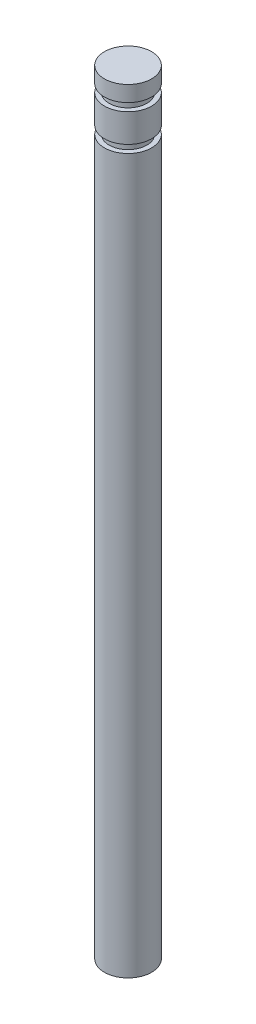
ISO-10303-21;
HEADER;
FILE_DESCRIPTION(('STEP AP214'),'2;1');
FILE_NAME('part.step','',(''),(''),'','','');
FILE_SCHEMA(('AUTOMOTIVE_DESIGN { 1 0 10303 214 1 1 1 1 }'));
ENDSEC;
DATA;
#1=APPLICATION_CONTEXT('core data for automotive mechanical design processes');
#2=APPLICATION_PROTOCOL_DEFINITION('international standard','automotive_design',2000,#1);
#3=PRODUCT_CONTEXT('',#1,'mechanical');
#4=PRODUCT('Part','Part','',(#3));
#5=PRODUCT_RELATED_PRODUCT_CATEGORY('part','',(#4));
#6=PRODUCT_DEFINITION_FORMATION('','',#4);
#7=PRODUCT_DEFINITION_CONTEXT('part definition',#1,'design');
#8=PRODUCT_DEFINITION('design','',#6,#7);
#9=PRODUCT_DEFINITION_SHAPE('','',#8);
#10=(LENGTH_UNIT() NAMED_UNIT(*) SI_UNIT(.MILLI.,.METRE.));
#11=(NAMED_UNIT(*) PLANE_ANGLE_UNIT() SI_UNIT($,.RADIAN.));
#12=(NAMED_UNIT(*) SI_UNIT($,.STERADIAN.) SOLID_ANGLE_UNIT());
#13=UNCERTAINTY_MEASURE_WITH_UNIT(LENGTH_MEASURE(1.E-05),#10,'distance_accuracy_value','');
#14=(GEOMETRIC_REPRESENTATION_CONTEXT(3) GLOBAL_UNCERTAINTY_ASSIGNED_CONTEXT((#13)) GLOBAL_UNIT_ASSIGNED_CONTEXT((#10,
#11,#12)) REPRESENTATION_CONTEXT('',''));
#15=CARTESIAN_POINT('',(0.,0.,0.));
#16=DIRECTION('',(0.,0.,1.));
#17=DIRECTION('',(1.,0.,0.));
#18=AXIS2_PLACEMENT_3D('',#15,#16,#17);
#19=CARTESIAN_POINT('',(0.,0.,0.));
#20=DIRECTION('',(0.,-1.,0.));
#21=DIRECTION('',(0.,0.,-1.));
#22=AXIS2_PLACEMENT_3D('',#19,#20,#21);
#23=CYLINDRICAL_SURFACE('',#22,1.2);
#24=CARTESIAN_POINT('',(0.,45.4,0.));
#25=DIRECTION('',(0.,-1.,0.));
#26=DIRECTION('',(0.,0.,-1.));
#27=AXIS2_PLACEMENT_3D('',#24,#25,#26);
#28=CIRCLE('',#27,1.2);
#29=CARTESIAN_POINT('',(0.,45.4,-1.2));
#30=VERTEX_POINT('',#29);
#31=EDGE_CURVE('E77',#30,#30,#28,.T.);
#32=ORIENTED_EDGE('',*,*,#31,.F.);
#33=EDGE_LOOP('',(#32));
#34=FACE_BOUND('',#33,.T.);
#35=CARTESIAN_POINT('',(0.,45.9,0.));
#36=DIRECTION('',(0.,-1.,0.));
#37=DIRECTION('',(0.,0.,-1.));
#38=AXIS2_PLACEMENT_3D('',#35,#36,#37);
#39=CIRCLE('',#38,1.2);
#40=CARTESIAN_POINT('',(0.,45.9,-1.2));
#41=VERTEX_POINT('',#40);
#42=EDGE_CURVE('E10',#41,#41,#39,.T.);
#43=ORIENTED_EDGE('',*,*,#42,.T.);
#44=EDGE_LOOP('',(#43));
#45=FACE_BOUND('',#44,.T.);
#46=ADVANCED_FACE('F43',(#34,#45),#23,.T.);
#47=CARTESIAN_POINT('',(0.,45.9,0.));
#48=DIRECTION('',(0.,1.,0.));
#49=DIRECTION('',(0.,0.,1.));
#50=AXIS2_PLACEMENT_3D('',#47,#48,#49);
#51=PLANE('',#50);
#52=ORIENTED_EDGE('',*,*,#42,.F.);
#53=EDGE_LOOP('',(#52));
#54=FACE_BOUND('',#53,.T.);
#55=CARTESIAN_POINT('',(0.,45.9,0.));
#56=DIRECTION('',(0.,-1.,0.));
#57=DIRECTION('',(0.,0.,-1.));
#58=AXIS2_PLACEMENT_3D('',#55,#56,#57);
#59=CIRCLE('',#58,1.5);
#60=CARTESIAN_POINT('',(0.,45.9,-1.5));
#61=VERTEX_POINT('',#60);
#62=EDGE_CURVE('E49',#61,#61,#59,.T.);
#63=ORIENTED_EDGE('',*,*,#62,.T.);
#64=EDGE_LOOP('',(#63));
#65=FACE_BOUND('',#64,.T.);
#66=ADVANCED_FACE('F85',(#54,#65),#51,.F.);
#67=CARTESIAN_POINT('',(0.,0.,0.));
#68=DIRECTION('',(0.,-1.,0.));
#69=DIRECTION('',(0.,0.,-1.));
#70=AXIS2_PLACEMENT_3D('',#67,#68,#69);
#71=CYLINDRICAL_SURFACE('',#70,1.5);
#72=CARTESIAN_POINT('',(0.,47.7,0.));
#73=DIRECTION('',(0.,-1.,0.));
#74=DIRECTION('',(0.,0.,-1.));
#75=AXIS2_PLACEMENT_3D('',#72,#73,#74);
#76=CIRCLE('',#75,1.5);
#77=CARTESIAN_POINT('',(0.,47.7,-1.5));
#78=VERTEX_POINT('',#77);
#79=EDGE_CURVE('E53',#78,#78,#76,.T.);
#80=ORIENTED_EDGE('',*,*,#79,.T.);
#81=EDGE_LOOP('',(#80));
#82=FACE_BOUND('',#81,.T.);
#83=ORIENTED_EDGE('',*,*,#62,.F.);
#84=EDGE_LOOP('',(#83));
#85=FACE_BOUND('',#84,.T.);
#86=ADVANCED_FACE('F89',(#82,#85),#71,.T.);
#87=CARTESIAN_POINT('',(0.,47.7,0.));
#88=DIRECTION('',(0.,1.,0.));
#89=DIRECTION('',(0.,0.,1.));
#90=AXIS2_PLACEMENT_3D('',#87,#88,#89);
#91=PLANE('',#90);
#92=CARTESIAN_POINT('',(0.,47.7,0.));
#93=DIRECTION('',(0.,-1.,0.));
#94=DIRECTION('',(0.,0.,-1.));
#95=AXIS2_PLACEMENT_3D('',#92,#93,#94);
#96=CIRCLE('',#95,1.2);
#97=CARTESIAN_POINT('',(0.,47.7,-1.2));
#98=VERTEX_POINT('',#97);
#99=EDGE_CURVE('E57',#98,#98,#96,.T.);
#100=ORIENTED_EDGE('',*,*,#99,.T.);
#101=EDGE_LOOP('',(#100));
#102=FACE_BOUND('',#101,.T.);
#103=ORIENTED_EDGE('',*,*,#79,.F.);
#104=EDGE_LOOP('',(#103));
#105=FACE_BOUND('',#104,.T.);
#106=ADVANCED_FACE('F94',(#102,#105),#91,.T.);
#107=CARTESIAN_POINT('',(0.,0.,0.));
#108=DIRECTION('',(0.,-1.,0.));
#109=DIRECTION('',(0.,0.,-1.));
#110=AXIS2_PLACEMENT_3D('',#107,#108,#109);
#111=CYLINDRICAL_SURFACE('',#110,1.2);
#112=ORIENTED_EDGE('',*,*,#99,.F.);
#113=EDGE_LOOP('',(#112));
#114=FACE_BOUND('',#113,.T.);
#115=CARTESIAN_POINT('',(0.,48.2,0.));
#116=DIRECTION('',(0.,-1.,0.));
#117=DIRECTION('',(0.,0.,-1.));
#118=AXIS2_PLACEMENT_3D('',#115,#116,#117);
#119=CIRCLE('',#118,1.2);
#120=CARTESIAN_POINT('',(0.,48.2,-1.2));
#121=VERTEX_POINT('',#120);
#122=EDGE_CURVE('E62',#121,#121,#119,.T.);
#123=ORIENTED_EDGE('',*,*,#122,.T.);
#124=EDGE_LOOP('',(#123));
#125=FACE_BOUND('',#124,.T.);
#126=ADVANCED_FACE('F102',(#114,#125),#111,.T.);
#127=CARTESIAN_POINT('',(0.,48.2,0.));
#128=DIRECTION('',(0.,1.,0.));
#129=DIRECTION('',(0.,0.,1.));
#130=AXIS2_PLACEMENT_3D('',#127,#128,#129);
#131=PLANE('',#130);
#132=ORIENTED_EDGE('',*,*,#122,.F.);
#133=EDGE_LOOP('',(#132));
#134=FACE_BOUND('',#133,.T.);
#135=CARTESIAN_POINT('',(0.,48.2,0.));
#136=DIRECTION('',(0.,-1.,0.));
#137=DIRECTION('',(0.,0.,-1.));
#138=AXIS2_PLACEMENT_3D('',#135,#136,#137);
#139=CIRCLE('',#138,1.5);
#140=CARTESIAN_POINT('',(0.,48.2,-1.5));
#141=VERTEX_POINT('',#140);
#142=EDGE_CURVE('E65',#141,#141,#139,.T.);
#143=ORIENTED_EDGE('',*,*,#142,.T.);
#144=EDGE_LOOP('',(#143));
#145=FACE_BOUND('',#144,.T.);
#146=ADVANCED_FACE('F106',(#134,#145),#131,.F.);
#147=CARTESIAN_POINT('',(0.,49.2,0.));
#148=DIRECTION('',(0.,-1.,0.));
#149=DIRECTION('',(0.,0.,-1.));
#150=AXIS2_PLACEMENT_3D('',#147,#148,#149);
#151=CIRCLE('',#150,1.5);
#152=CARTESIAN_POINT('',(0.,49.2,-1.5));
#153=VERTEX_POINT('',#152);
#154=EDGE_CURVE('E68',#153,#153,#151,.T.);
#155=ORIENTED_EDGE('',*,*,#154,.T.);
#156=EDGE_LOOP('',(#155));
#157=FACE_BOUND('',#156,.T.);
#158=ORIENTED_EDGE('',*,*,#142,.F.);
#159=EDGE_LOOP('',(#158));
#160=FACE_BOUND('',#159,.T.);
#161=ADVANCED_FACE('F97',(#157,#160),#71,.T.);
#162=CARTESIAN_POINT('',(0.,49.2,0.));
#163=DIRECTION('',(0.,-1.,0.));
#164=DIRECTION('',(0.,0.,-1.));
#165=AXIS2_PLACEMENT_3D('',#162,#163,#164);
#166=PLANE('',#165);
#167=ORIENTED_EDGE('',*,*,#154,.F.);
#168=EDGE_LOOP('',(#167));
#169=FACE_BOUND('',#168,.T.);
#170=ADVANCED_FACE('F111',(#169),#166,.F.);
#171=CARTESIAN_POINT('',(0.,0.,0.));
#172=DIRECTION('',(0.,-1.,0.));
#173=DIRECTION('',(0.,0.,-1.));
#174=AXIS2_PLACEMENT_3D('',#171,#172,#173);
#175=PLANE('',#174);
#176=CARTESIAN_POINT('',(0.,0.,0.));
#177=DIRECTION('',(0.,-1.,0.));
#178=DIRECTION('',(0.,0.,-1.));
#179=AXIS2_PLACEMENT_3D('',#176,#177,#178);
#180=CIRCLE('',#179,1.5);
#181=CARTESIAN_POINT('',(0.,0.,-1.5));
#182=VERTEX_POINT('',#181);
#183=EDGE_CURVE('E71',#182,#182,#180,.T.);
#184=ORIENTED_EDGE('',*,*,#183,.T.);
#185=EDGE_LOOP('',(#184));
#186=FACE_BOUND('',#185,.T.);
#187=ADVANCED_FACE('F114',(#186),#175,.T.);
#188=CARTESIAN_POINT('',(0.,45.4,0.));
#189=DIRECTION('',(0.,-1.,0.));
#190=DIRECTION('',(0.,0.,-1.));
#191=AXIS2_PLACEMENT_3D('',#188,#189,#190);
#192=CIRCLE('',#191,1.5);
#193=CARTESIAN_POINT('',(0.,45.4,-1.5));
#194=VERTEX_POINT('',#193);
#195=EDGE_CURVE('E74',#194,#194,#192,.T.);
#196=ORIENTED_EDGE('',*,*,#195,.T.);
#197=EDGE_LOOP('',(#196));
#198=FACE_BOUND('',#197,.T.);
#199=ORIENTED_EDGE('',*,*,#183,.F.);
#200=EDGE_LOOP('',(#199));
#201=FACE_BOUND('',#200,.T.);
#202=ADVANCED_FACE('F98',(#198,#201),#71,.T.);
#203=CARTESIAN_POINT('',(0.,45.4,0.));
#204=DIRECTION('',(0.,1.,0.));
#205=DIRECTION('',(0.,0.,1.));
#206=AXIS2_PLACEMENT_3D('',#203,#204,#205);
#207=PLANE('',#206);
#208=ORIENTED_EDGE('',*,*,#31,.T.);
#209=EDGE_LOOP('',(#208));
#210=FACE_BOUND('',#209,.T.);
#211=ORIENTED_EDGE('',*,*,#195,.F.);
#212=EDGE_LOOP('',(#211));
#213=FACE_BOUND('',#212,.T.);
#214=ADVANCED_FACE('F81',(#210,#213),#207,.T.);
#215=CLOSED_SHELL('',(#46,#66,#86,#106,#126,#146,#161,#170,#187,#202,#214));
#216=MANIFOLD_SOLID_BREP('B2',#215);
#217=ADVANCED_BREP_SHAPE_REPRESENTATION('',(#18,#216),#14);
#218=SHAPE_DEFINITION_REPRESENTATION(#9,#217);
ENDSEC;
END-ISO-10303-21;
